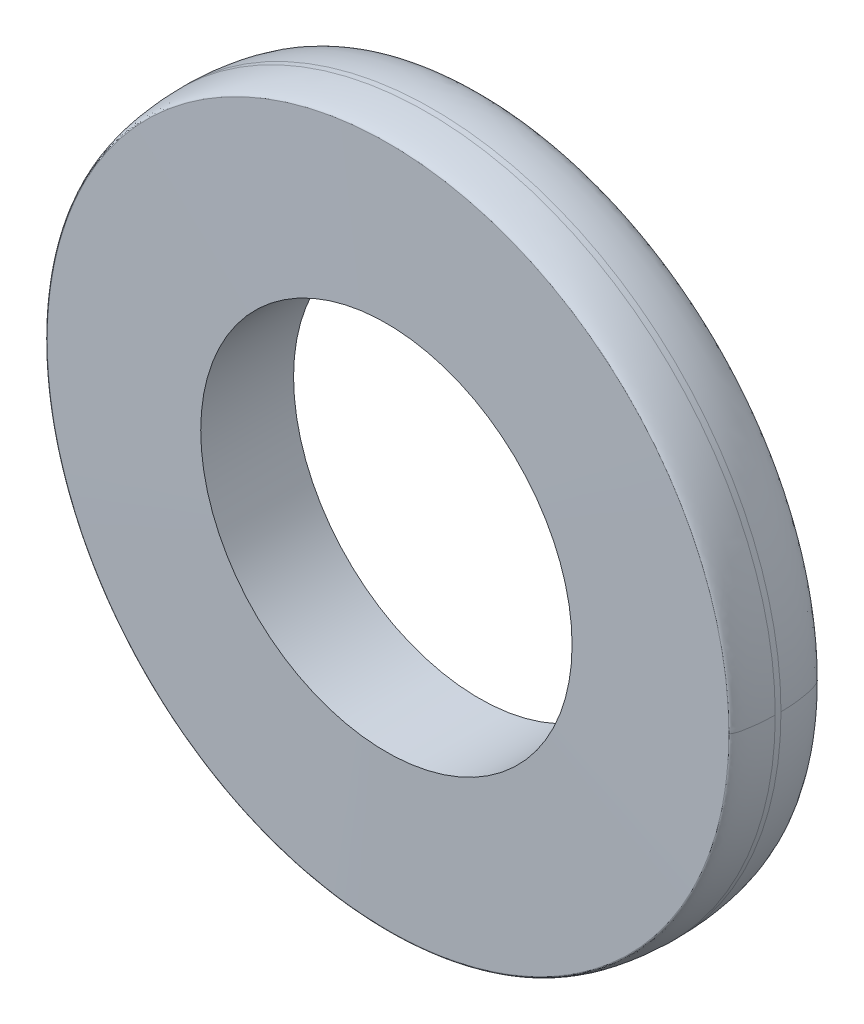
ISO-10303-21;
HEADER;
FILE_DESCRIPTION(('STEP AP214'),'2;1');
FILE_NAME('part.step','',(''),(''),'','','');
FILE_SCHEMA(('AUTOMOTIVE_DESIGN { 1 0 10303 214 1 1 1 1 }'));
ENDSEC;
DATA;
#1=APPLICATION_CONTEXT('core data for automotive mechanical design processes');
#2=APPLICATION_PROTOCOL_DEFINITION('international standard','automotive_design',2000,#1);
#3=PRODUCT_CONTEXT('',#1,'mechanical');
#4=PRODUCT('Part','Part','',(#3));
#5=PRODUCT_RELATED_PRODUCT_CATEGORY('part','',(#4));
#6=PRODUCT_DEFINITION_FORMATION('','',#4);
#7=PRODUCT_DEFINITION_CONTEXT('part definition',#1,'design');
#8=PRODUCT_DEFINITION('design','',#6,#7);
#9=PRODUCT_DEFINITION_SHAPE('','',#8);
#10=(LENGTH_UNIT() NAMED_UNIT(*) SI_UNIT(.MILLI.,.METRE.));
#11=(NAMED_UNIT(*) PLANE_ANGLE_UNIT() SI_UNIT($,.RADIAN.));
#12=(NAMED_UNIT(*) SI_UNIT($,.STERADIAN.) SOLID_ANGLE_UNIT());
#13=UNCERTAINTY_MEASURE_WITH_UNIT(LENGTH_MEASURE(1.E-05),#10,'distance_accuracy_value','');
#14=(GEOMETRIC_REPRESENTATION_CONTEXT(3) GLOBAL_UNCERTAINTY_ASSIGNED_CONTEXT((#13)) GLOBAL_UNIT_ASSIGNED_CONTEXT((#10,
#11,#12)) REPRESENTATION_CONTEXT('',''));
#15=CARTESIAN_POINT('',(0.,0.,0.));
#16=DIRECTION('',(0.,0.,1.));
#17=DIRECTION('',(1.,0.,0.));
#18=AXIS2_PLACEMENT_3D('',#15,#16,#17);
#19=CARTESIAN_POINT('',(30.,0.,0.));
#20=DIRECTION('',(0.,0.,-1.));
#21=DIRECTION('',(1.,0.,0.));
#22=AXIS2_PLACEMENT_3D('',#19,#20,#21);
#23=CYLINDRICAL_SURFACE('',#22,6.);
#24=CARTESIAN_POINT('',(30.,0.,-0.800000000000393));
#25=DIRECTION('',(0.,0.,1.));
#26=DIRECTION('',(1.,0.,0.));
#27=AXIS2_PLACEMENT_3D('',#24,#25,#26);
#28=CIRCLE('',#27,6.);
#29=CARTESIAN_POINT('',(24.,0.,-0.800000000000393));
#30=VERTEX_POINT('',#29);
#31=CARTESIAN_POINT('',(36.,0.,-0.800000000000393));
#32=VERTEX_POINT('',#31);
#33=EDGE_CURVE('E238',#30,#32,#28,.T.);
#34=ORIENTED_EDGE('',*,*,#33,.T.);
#35=CARTESIAN_POINT('',(30.,0.,-0.800000000000393));
#36=DIRECTION('',(0.,0.,1.));
#37=DIRECTION('',(-1.,0.,0.));
#38=AXIS2_PLACEMENT_3D('',#35,#36,#37);
#39=CIRCLE('',#38,6.);
#40=EDGE_CURVE('E235',#32,#30,#39,.T.);
#41=ORIENTED_EDGE('',*,*,#40,.T.);
#42=DIRECTION('',(0.,0.,1.));
#43=VECTOR('',#42,1.);
#44=CARTESIAN_POINT('',(24.,0.,0.));
#45=LINE('',#44,#43);
#46=CARTESIAN_POINT('',(24.,0.,-0.701366409497633));
#47=VERTEX_POINT('',#46);
#48=EDGE_CURVE('E10',#30,#47,#45,.T.);
#49=ORIENTED_EDGE('',*,*,#48,.T.);
#50=CARTESIAN_POINT('',(30.,0.,-0.701366409496622));
#51=DIRECTION('',(0.,0.,-1.));
#52=DIRECTION('',(-1.,0.,0.));
#53=AXIS2_PLACEMENT_3D('',#50,#51,#52);
#54=CIRCLE('',#53,6.);
#55=CARTESIAN_POINT('',(36.,0.,-0.701366409497633));
#56=VERTEX_POINT('',#55);
#57=EDGE_CURVE('E98',#47,#56,#54,.T.);
#58=ORIENTED_EDGE('',*,*,#57,.T.);
#59=CARTESIAN_POINT('',(30.,0.,-0.701366409497633));
#60=DIRECTION('',(0.,0.,1.));
#61=DIRECTION('',(1.,0.,0.));
#62=AXIS2_PLACEMENT_3D('',#59,#60,#61);
#63=CIRCLE('',#62,6.);
#64=EDGE_CURVE('E182',#47,#56,#63,.T.);
#65=ORIENTED_EDGE('',*,*,#64,.F.);
#66=ORIENTED_EDGE('',*,*,#48,.F.);
#67=EDGE_LOOP('',(#34,#41,#49,#58,#65,#66));
#68=FACE_BOUND('',#67,.T.);
#69=ADVANCED_FACE('F15',(#68),#23,.T.);
#70=CARTESIAN_POINT('',(30.,0.,0.));
#71=DIRECTION('',(0.,0.,-1.));
#72=DIRECTION('',(1.,0.,0.));
#73=AXIS2_PLACEMENT_3D('',#70,#71,#72);
#74=CYLINDRICAL_SURFACE('',#73,3.2);
#75=CARTESIAN_POINT('',(30.,0.,-1.6));
#76=DIRECTION('',(0.,0.,1.));
#77=DIRECTION('',(1.,0.,0.));
#78=AXIS2_PLACEMENT_3D('',#75,#76,#77);
#79=CIRCLE('',#78,3.2);
#80=CARTESIAN_POINT('',(26.8,0.,-1.6));
#81=VERTEX_POINT('',#80);
#82=EDGE_CURVE('E105',#81,#81,#79,.T.);
#83=ORIENTED_EDGE('',*,*,#82,.F.);
#84=DIRECTION('',(0.,0.,1.));
#85=VECTOR('',#84,1.);
#86=CARTESIAN_POINT('',(26.8,0.,0.));
#87=LINE('',#86,#85);
#88=CARTESIAN_POINT('',(26.8,0.,0.));
#89=VERTEX_POINT('',#88);
#90=EDGE_CURVE('E33',#81,#89,#87,.T.);
#91=ORIENTED_EDGE('',*,*,#90,.T.);
#92=CARTESIAN_POINT('',(30.,0.,0.));
#93=DIRECTION('',(0.,0.,1.));
#94=DIRECTION('',(1.,0.,0.));
#95=AXIS2_PLACEMENT_3D('',#92,#93,#94);
#96=CIRCLE('',#95,3.2);
#97=CARTESIAN_POINT('',(33.2,0.,0.));
#98=VERTEX_POINT('',#97);
#99=EDGE_CURVE('E78',#89,#98,#96,.T.);
#100=ORIENTED_EDGE('',*,*,#99,.T.);
#101=CARTESIAN_POINT('',(30.,0.,0.));
#102=DIRECTION('',(0.,0.,1.));
#103=DIRECTION('',(1.,0.,0.));
#104=AXIS2_PLACEMENT_3D('',#101,#102,#103);
#105=CIRCLE('',#104,3.2);
#106=EDGE_CURVE('E74',#98,#89,#105,.T.);
#107=ORIENTED_EDGE('',*,*,#106,.T.);
#108=ORIENTED_EDGE('',*,*,#90,.F.);
#109=EDGE_LOOP('',(#83,#91,#100,#107,#108));
#110=FACE_BOUND('',#109,.T.);
#111=ADVANCED_FACE('F85',(#110),#74,.F.);
#112=CARTESIAN_POINT('',(30.,3.,-1.6));
#113=DIRECTION('',(0.,0.,1.));
#114=DIRECTION('',(1.,0.,0.));
#115=AXIS2_PLACEMENT_3D('',#112,#113,#114);
#116=PLANE('',#115);
#117=ORIENTED_EDGE('',*,*,#82,.T.);
#118=EDGE_LOOP('',(#117));
#119=FACE_BOUND('',#118,.T.);
#120=CARTESIAN_POINT('',(30.,0.,-1.6));
#121=DIRECTION('',(0.,0.,1.));
#122=DIRECTION('',(-1.,0.,0.));
#123=AXIS2_PLACEMENT_3D('',#120,#121,#122);
#124=CIRCLE('',#123,5.8063392313732);
#125=CARTESIAN_POINT('',(35.8063392313732,0.,-1.6));
#126=VERTEX_POINT('',#125);
#127=CARTESIAN_POINT('',(24.1936607686268,0.,-1.6));
#128=VERTEX_POINT('',#127);
#129=EDGE_CURVE('E79',#126,#128,#124,.T.);
#130=ORIENTED_EDGE('',*,*,#129,.F.);
#131=CARTESIAN_POINT('',(30.,0.,-1.6));
#132=DIRECTION('',(0.,0.,1.));
#133=DIRECTION('',(1.,0.,0.));
#134=AXIS2_PLACEMENT_3D('',#131,#132,#133);
#135=CIRCLE('',#134,5.8063392313732);
#136=EDGE_CURVE('E184',#128,#126,#135,.T.);
#137=ORIENTED_EDGE('',*,*,#136,.F.);
#138=EDGE_LOOP('',(#130,#137));
#139=FACE_BOUND('',#138,.T.);
#140=ADVANCED_FACE('F140',(#119,#139),#116,.F.);
#141=CARTESIAN_POINT('',(24.1936607686268,0.,-1.6));
#142=CARTESIAN_POINT('',(24.1936607686268,-5.8063392313732,-1.6));
#143=CARTESIAN_POINT('',(30.,-5.8063392313732,-1.6));
#144=CARTESIAN_POINT('',(35.8063392313732,-5.8063392313732,-1.6));
#145=CARTESIAN_POINT('',(35.8063392313732,0.,-1.6));
#146=CARTESIAN_POINT('',(35.8063392313732,5.8063392313732,-1.6));
#147=CARTESIAN_POINT('',(30.,5.8063392313732,-1.6));
#148=CARTESIAN_POINT('',(24.1936607686268,5.8063392313732,-1.6));
#149=CARTESIAN_POINT('',(24.1936607686268,0.,-1.6));
#150=CARTESIAN_POINT('',(24.1823051950255,0.,-1.6));
#151=CARTESIAN_POINT('',(24.1823051950255,-5.81769480497445,-1.6));
#152=CARTESIAN_POINT('',(30.,-5.81769480497445,-1.6));
#153=CARTESIAN_POINT('',(35.8176948049745,-5.81769480497445,-1.6));
#154=CARTESIAN_POINT('',(35.8176948049745,0.,-1.6));
#155=CARTESIAN_POINT('',(35.8176948049745,5.81769480497445,-1.6));
#156=CARTESIAN_POINT('',(30.,5.81769480497445,-1.6));
#157=CARTESIAN_POINT('',(24.1823051950255,5.81769480497445,-1.6));
#158=CARTESIAN_POINT('',(24.1823051950255,0.,-1.6));
#159=CARTESIAN_POINT('',(24.1598204836808,0.,-1.5918225297912));
#160=CARTESIAN_POINT('',(24.1598204836808,-5.8401795163192,-1.5918225297912));
#161=CARTESIAN_POINT('',(30.,-5.8401795163192,-1.5918225297912));
#162=CARTESIAN_POINT('',(35.8401795163192,-5.8401795163192,-1.5918225297912));
#163=CARTESIAN_POINT('',(35.8401795163192,0.,-1.5918225297912));
#164=CARTESIAN_POINT('',(35.8401795163192,5.8401795163192,-1.5918225297912));
#165=CARTESIAN_POINT('',(30.,5.8401795163192,-1.5918225297912));
#166=CARTESIAN_POINT('',(24.1598204836808,5.8401795163192,-1.5918225297912));
#167=CARTESIAN_POINT('',(24.1598204836808,0.,-1.5918225297912));
#168=CARTESIAN_POINT('',(24.1267728464192,0.,-1.55502547306696));
#169=CARTESIAN_POINT('',(24.1267728464192,-5.87322715358078,-1.55502547306696));
#170=CARTESIAN_POINT('',(30.,-5.87322715358078,-1.55502547306696));
#171=CARTESIAN_POINT('',(35.8732271535808,-5.87322715358078,-1.55502547306696));
#172=CARTESIAN_POINT('',(35.8732271535808,0.,-1.55502547306696));
#173=CARTESIAN_POINT('',(35.8732271535808,5.87322715358078,-1.55502547306696));
#174=CARTESIAN_POINT('',(30.,5.87322715358078,-1.55502547306696));
#175=CARTESIAN_POINT('',(24.1267728464192,5.87322715358078,-1.55502547306696));
#176=CARTESIAN_POINT('',(24.1267728464192,0.,-1.55502547306696));
#177=CARTESIAN_POINT('',(24.0848655645913,0.,-1.45950479029294));
#178=CARTESIAN_POINT('',(24.0848655645913,-5.91513443540874,-1.45950479029294));
#179=CARTESIAN_POINT('',(30.,-5.91513443540874,-1.45950479029294));
#180=CARTESIAN_POINT('',(35.9151344354087,-5.91513443540874,-1.45950479029294));
#181=CARTESIAN_POINT('',(35.9151344354087,0.,-1.45950479029294));
#182=CARTESIAN_POINT('',(35.9151344354087,5.91513443540874,-1.45950479029294));
#183=CARTESIAN_POINT('',(30.,5.91513443540874,-1.45950479029294));
#184=CARTESIAN_POINT('',(24.0848655645913,5.91513443540874,-1.45950479029294));
#185=CARTESIAN_POINT('',(24.0848655645913,0.,-1.45950479029294));
#186=CARTESIAN_POINT('',(24.0404339071554,0.,-1.27744318091335));
#187=CARTESIAN_POINT('',(24.0404339071554,-5.95956609284458,-1.27744318091335));
#188=CARTESIAN_POINT('',(30.,-5.95956609284458,-1.27744318091335));
#189=CARTESIAN_POINT('',(35.9595660928446,-5.95956609284458,-1.27744318091335));
#190=CARTESIAN_POINT('',(35.9595660928446,0.,-1.27744318091335));
#191=CARTESIAN_POINT('',(35.9595660928446,5.95956609284458,-1.27744318091335));
#192=CARTESIAN_POINT('',(30.,5.95956609284458,-1.27744318091335));
#193=CARTESIAN_POINT('',(24.0404339071554,5.95956609284458,-1.27744318091335));
#194=CARTESIAN_POINT('',(24.0404339071554,0.,-1.27744318091335));
#195=CARTESIAN_POINT('',(24.0152230661895,0.,-1.09612786657397));
#196=CARTESIAN_POINT('',(24.0152230661895,-5.98477693381051,-1.09612786657397));
#197=CARTESIAN_POINT('',(30.,-5.98477693381051,-1.09612786657397));
#198=CARTESIAN_POINT('',(35.9847769338105,-5.98477693381051,-1.09612786657397));
#199=CARTESIAN_POINT('',(35.9847769338105,0.,-1.09612786657397));
#200=CARTESIAN_POINT('',(35.9847769338105,5.98477693381051,-1.09612786657397));
#201=CARTESIAN_POINT('',(30.,5.98477693381051,-1.09612786657397));
#202=CARTESIAN_POINT('',(24.0152230661895,5.98477693381051,-1.09612786657397));
#203=CARTESIAN_POINT('',(24.0152230661895,0.,-1.09612786657397));
#204=CARTESIAN_POINT('',(24.0042897505086,0.,-0.950202262335004));
#205=CARTESIAN_POINT('',(24.0042897505086,-5.99571024949142,-0.950202262335005));
#206=CARTESIAN_POINT('',(30.,-5.99571024949142,-0.950202262335004));
#207=CARTESIAN_POINT('',(35.9957102494914,-5.99571024949142,-0.950202262335005));
#208=CARTESIAN_POINT('',(35.9957102494914,0.,-0.950202262335004));
#209=CARTESIAN_POINT('',(35.9957102494914,5.99571024949142,-0.950202262335005));
#210=CARTESIAN_POINT('',(30.,5.99571024949142,-0.950202262335004));
#211=CARTESIAN_POINT('',(24.0042897505086,5.99571024949142,-0.950202262335005));
#212=CARTESIAN_POINT('',(24.0042897505086,0.,-0.950202262335004));
#213=CARTESIAN_POINT('',(24.0008098857186,0.,-0.851316488468443));
#214=CARTESIAN_POINT('',(24.0008098857186,-5.99919011428141,-0.851316488468443));
#215=CARTESIAN_POINT('',(30.,-5.99919011428141,-0.851316488468443));
#216=CARTESIAN_POINT('',(35.9991901142814,-5.99919011428141,-0.851316488468443));
#217=CARTESIAN_POINT('',(35.9991901142814,0.,-0.851316488468443));
#218=CARTESIAN_POINT('',(35.9991901142814,5.99919011428141,-0.851316488468443));
#219=CARTESIAN_POINT('',(30.,5.99919011428141,-0.851316488468443));
#220=CARTESIAN_POINT('',(24.0008098857186,5.99919011428141,-0.851316488468443));
#221=CARTESIAN_POINT('',(24.0008098857186,0.,-0.851316488468443));
#222=CARTESIAN_POINT('',(24.0000201274692,0.,-0.801316930978833));
#223=CARTESIAN_POINT('',(24.0000201274692,-5.99997987253079,-0.801316930978833));
#224=CARTESIAN_POINT('',(30.,-5.99997987253079,-0.801316930978833));
#225=CARTESIAN_POINT('',(35.9999798725308,-5.99997987253079,-0.801316930978833));
#226=CARTESIAN_POINT('',(35.9999798725308,0.,-0.801316930978833));
#227=CARTESIAN_POINT('',(35.9999798725308,5.99997987253079,-0.801316930978833));
#228=CARTESIAN_POINT('',(30.,5.99997987253079,-0.801316930978833));
#229=CARTESIAN_POINT('',(24.0000201274692,5.99997987253079,-0.801316930978833));
#230=CARTESIAN_POINT('',(24.0000201274692,0.,-0.801316930978833));
#231=CARTESIAN_POINT('',(24.,0.,-0.800000000000393));
#232=CARTESIAN_POINT('',(24.,-6.,-0.800000000000392));
#233=CARTESIAN_POINT('',(30.,-6.,-0.800000000000393));
#234=CARTESIAN_POINT('',(36.,-6.,-0.800000000000392));
#235=CARTESIAN_POINT('',(36.,0.,-0.800000000000393));
#236=CARTESIAN_POINT('',(36.,6.,-0.800000000000392));
#237=CARTESIAN_POINT('',(30.,6.,-0.800000000000393));
#238=CARTESIAN_POINT('',(24.,6.,-0.800000000000392));
#239=CARTESIAN_POINT('',(24.,0.,-0.800000000000393));
#240=(BOUNDED_SURFACE() B_SPLINE_SURFACE(5,2,((#141,#142,#143,#144,#145,#146,#147,#148,#149),
(#150,#151,#152,#153,#154,#155,#156,#157,#158),(#159,#160,#161,#162,#163,#164,#165,#166,#167),
(#168,#169,#170,#171,#172,#173,#174,#175,#176),(#177,#178,#179,#180,#181,#182,#183,#184,#185),
(#186,#187,#188,#189,#190,#191,#192,#193,#194),(#195,#196,#197,#198,#199,#200,#201,#202,#203),
(#204,#205,#206,#207,#208,#209,#210,#211,#212),(#213,#214,#215,#216,#217,#218,#219,#220,#221),
(#222,#223,#224,#225,#226,#227,#228,#229,#230),(#231,#232,#233,#234,#235,#236,#237,#238,#239)),
.UNSPECIFIED.,.F.,.T.,.F.) B_SPLINE_SURFACE_WITH_KNOTS((6,1,1,1,1,1,6),(3,2,2,2,3),(0.,0.1,0.2,
0.3,0.4,0.5,0.502705302004715),(0.,1.5707963267949,3.14159265358979,4.71238898038469,
6.28318530717959),.UNSPECIFIED.) GEOMETRIC_REPRESENTATION_ITEM() RATIONAL_B_SPLINE_SURFACE(((1.,
0.707106781186548,1.,0.707106781186548,1.,0.707106781186548,1.,0.707106781186548,1.),(1.,
0.707106781186548,1.,0.707106781186548,1.,0.707106781186548,1.,0.707106781186548,1.),(1.,
0.707106781186548,1.,0.707106781186548,1.,0.707106781186548,1.,0.707106781186548,1.),(1.,
0.707106781186548,1.,0.707106781186548,1.,0.707106781186548,1.,0.707106781186548,1.),(1.,
0.707106781186548,1.,0.707106781186548,1.,0.707106781186548,1.,0.707106781186548,1.),(1.,
0.707106781186548,1.,0.707106781186548,1.,0.707106781186548,1.,0.707106781186548,1.),(1.,
0.707106781186548,1.,0.707106781186548,1.,0.707106781186548,1.,0.707106781186548,1.),(1.,
0.707106781186548,1.,0.707106781186548,1.,0.707106781186548,1.,0.707106781186548,1.),(1.,
0.707106781186548,1.,0.707106781186548,1.,0.707106781186548,1.,0.707106781186548,1.),(1.,
0.707106781186548,1.,0.707106781186548,1.,0.707106781186548,1.,0.707106781186548,1.),(1.,
0.707106781186548,1.,0.707106781186548,1.,0.707106781186548,1.,0.707106781186548,1.))) REPRESENTATION_ITEM('') SURFACE());
#241=CARTESIAN_POINT('',(35.8063392313732,0.,-1.6));
#242=CARTESIAN_POINT('',(35.8099378753464,0.,-1.6));
#243=CARTESIAN_POINT('',(35.8134726247188,0.,-1.59950721564896));
#244=CARTESIAN_POINT('',(35.8206184009906,0.,-1.59756463817466));
#245=CARTESIAN_POINT('',(35.8241287090741,0.,-1.59608642434894));
#246=CARTESIAN_POINT('',(35.8352869308805,0.,-1.58998694561831));
#247=CARTESIAN_POINT('',(35.8422611236592,0.,-1.58375549246989));
#248=CARTESIAN_POINT('',(35.8641150043949,0.,-1.55964714317547));
#249=CARTESIAN_POINT('',(35.8775926398337,0.,-1.53446812127592));
#250=CARTESIAN_POINT('',(35.9142939112526,0.,-1.45153185081873));
#251=CARTESIAN_POINT('',(35.9377417361998,0.,-1.36662566906088));
#252=CARTESIAN_POINT('',(35.9802687650628,0.,-1.13751947712534));
#253=CARTESIAN_POINT('',(35.9972755095937,0.,-0.97826214411609));
#254=CARTESIAN_POINT('',(36.,0.,-0.800000000000393));
#255=(BOUNDED_CURVE() B_SPLINE_CURVE(3,(#241,#242,#243,#244,#245,#246,#247,#248,#249,#250,#251,
#252,#253,#254),.UNSPECIFIED.,.F.,.F.) B_SPLINE_CURVE_WITH_KNOTS((4,2,2,2,2,2,4),(0.,
0.00256248450711401,0.005273204596122,0.011618915438262,0.0284820292416233,0.0698556169275208,
0.123340505807867),
.UNSPECIFIED.) CURVE() GEOMETRIC_REPRESENTATION_ITEM() RATIONAL_B_SPLINE_CURVE((1.,1.,1.,1.,1.,
1.,1.,1.,1.,1.,1.,1.,1.,1.)) REPRESENTATION_ITEM(''));
#256=EDGE_CURVE('E232',#126,#32,#255,.T.);
#257=CARTESIAN_POINT('',(24.,0.,-0.800000000000393));
#258=CARTESIAN_POINT('',(24.0027244904063,0.,-0.97826214411609));
#259=CARTESIAN_POINT('',(24.0197312349372,0.,-1.13751947712534));
#260=CARTESIAN_POINT('',(24.0622582638002,0.,-1.36662566906088));
#261=CARTESIAN_POINT('',(24.0857060887474,0.,-1.45153185081873));
#262=CARTESIAN_POINT('',(24.1224073601663,0.,-1.53446812127592));
#263=CARTESIAN_POINT('',(24.1358849956051,0.,-1.55964714317547));
#264=CARTESIAN_POINT('',(24.1577388763408,0.,-1.58375549246989));
#265=CARTESIAN_POINT('',(24.1647130691195,0.,-1.58998694561831));
#266=CARTESIAN_POINT('',(24.1758712909259,0.,-1.59608642434894));
#267=CARTESIAN_POINT('',(24.1793815990094,0.,-1.59756463817466));
#268=CARTESIAN_POINT('',(24.1865273752812,0.,-1.59950721564896));
#269=CARTESIAN_POINT('',(24.1900621246536,0.,-1.6));
#270=CARTESIAN_POINT('',(24.1936607686268,0.,-1.6));
#271=(BOUNDED_CURVE() B_SPLINE_CURVE(3,(#257,#258,#259,#260,#261,#262,#263,#264,#265,#266,#267,
#268,#269,#270),.UNSPECIFIED.,.F.,.F.) B_SPLINE_CURVE_WITH_KNOTS((4,2,2,2,2,2,4),(0.,
0.0534848888803462,0.0948584765662437,0.111721590369605,0.118067301211745,0.120778021300753,
0.123340505807867),
.UNSPECIFIED.) CURVE() GEOMETRIC_REPRESENTATION_ITEM() RATIONAL_B_SPLINE_CURVE((1.,1.,1.,1.,1.,
1.,1.,1.,1.,1.,1.,1.,1.,1.)) REPRESENTATION_ITEM(''));
#272=EDGE_CURVE('E109',#30,#128,#271,.T.);
#273=CARTESIAN_POINT('',(30.,-5.8063392313732,-1.6));
#274=CARTESIAN_POINT('',(35.8063392313732,-5.8063392313732,-1.6));
#275=CARTESIAN_POINT('',(35.8063392313732,0.,-1.6));
#276=CARTESIAN_POINT('',(35.8063392313732,5.8063392313732,-1.6));
#277=CARTESIAN_POINT('',(30.,5.8063392313732,-1.6));
#278=CARTESIAN_POINT('',(24.1936607686268,5.8063392313732,-1.6));
#279=CARTESIAN_POINT('',(24.1936607686268,0.,-1.6));
#280=CARTESIAN_POINT('',(24.1936607686268,-5.8063392313732,-1.6));
#281=CARTESIAN_POINT('',(30.,-5.8063392313732,-1.6));
#282=CARTESIAN_POINT('',(30.,-5.81769480497445,-1.6));
#283=CARTESIAN_POINT('',(35.8176948049745,-5.81769480497445,-1.6));
#284=CARTESIAN_POINT('',(35.8176948049745,0.,-1.6));
#285=CARTESIAN_POINT('',(35.8176948049745,5.81769480497445,-1.6));
#286=CARTESIAN_POINT('',(30.,5.81769480497445,-1.6));
#287=CARTESIAN_POINT('',(24.1823051950255,5.81769480497445,-1.6));
#288=CARTESIAN_POINT('',(24.1823051950255,0.,-1.6));
#289=CARTESIAN_POINT('',(24.1823051950255,-5.81769480497445,-1.6));
#290=CARTESIAN_POINT('',(30.,-5.81769480497445,-1.6));
#291=CARTESIAN_POINT('',(30.,-5.8401795163192,-1.5918225297912));
#292=CARTESIAN_POINT('',(35.8401795163192,-5.8401795163192,-1.5918225297912));
#293=CARTESIAN_POINT('',(35.8401795163192,0.,-1.5918225297912));
#294=CARTESIAN_POINT('',(35.8401795163192,5.8401795163192,-1.5918225297912));
#295=CARTESIAN_POINT('',(30.,5.8401795163192,-1.5918225297912));
#296=CARTESIAN_POINT('',(24.1598204836808,5.8401795163192,-1.5918225297912));
#297=CARTESIAN_POINT('',(24.1598204836808,0.,-1.5918225297912));
#298=CARTESIAN_POINT('',(24.1598204836808,-5.8401795163192,-1.5918225297912));
#299=CARTESIAN_POINT('',(30.,-5.8401795163192,-1.5918225297912));
#300=CARTESIAN_POINT('',(30.,-5.87322715358078,-1.55502547306696));
#301=CARTESIAN_POINT('',(35.8732271535808,-5.87322715358078,-1.55502547306696));
#302=CARTESIAN_POINT('',(35.8732271535808,0.,-1.55502547306696));
#303=CARTESIAN_POINT('',(35.8732271535808,5.87322715358078,-1.55502547306696));
#304=CARTESIAN_POINT('',(30.,5.87322715358078,-1.55502547306696));
#305=CARTESIAN_POINT('',(24.1267728464192,5.87322715358078,-1.55502547306696));
#306=CARTESIAN_POINT('',(24.1267728464192,0.,-1.55502547306696));
#307=CARTESIAN_POINT('',(24.1267728464192,-5.87322715358078,-1.55502547306696));
#308=CARTESIAN_POINT('',(30.,-5.87322715358078,-1.55502547306696));
#309=CARTESIAN_POINT('',(30.,-5.91513443540874,-1.45950479029294));
#310=CARTESIAN_POINT('',(35.9151344354087,-5.91513443540874,-1.45950479029294));
#311=CARTESIAN_POINT('',(35.9151344354087,0.,-1.45950479029294));
#312=CARTESIAN_POINT('',(35.9151344354087,5.91513443540874,-1.45950479029294));
#313=CARTESIAN_POINT('',(30.,5.91513443540874,-1.45950479029294));
#314=CARTESIAN_POINT('',(24.0848655645913,5.91513443540874,-1.45950479029294));
#315=CARTESIAN_POINT('',(24.0848655645913,0.,-1.45950479029294));
#316=CARTESIAN_POINT('',(24.0848655645913,-5.91513443540874,-1.45950479029294));
#317=CARTESIAN_POINT('',(30.,-5.91513443540874,-1.45950479029294));
#318=CARTESIAN_POINT('',(30.,-5.95956609284458,-1.27744318091335));
#319=CARTESIAN_POINT('',(35.9595660928446,-5.95956609284458,-1.27744318091335));
#320=CARTESIAN_POINT('',(35.9595660928446,0.,-1.27744318091335));
#321=CARTESIAN_POINT('',(35.9595660928446,5.95956609284458,-1.27744318091335));
#322=CARTESIAN_POINT('',(30.,5.95956609284458,-1.27744318091335));
#323=CARTESIAN_POINT('',(24.0404339071554,5.95956609284458,-1.27744318091335));
#324=CARTESIAN_POINT('',(24.0404339071554,0.,-1.27744318091335));
#325=CARTESIAN_POINT('',(24.0404339071554,-5.95956609284458,-1.27744318091335));
#326=CARTESIAN_POINT('',(30.,-5.95956609284458,-1.27744318091335));
#327=CARTESIAN_POINT('',(30.,-5.98477693381051,-1.09612786657397));
#328=CARTESIAN_POINT('',(35.9847769338105,-5.98477693381051,-1.09612786657397));
#329=CARTESIAN_POINT('',(35.9847769338105,0.,-1.09612786657397));
#330=CARTESIAN_POINT('',(35.9847769338105,5.98477693381051,-1.09612786657397));
#331=CARTESIAN_POINT('',(30.,5.98477693381051,-1.09612786657397));
#332=CARTESIAN_POINT('',(24.0152230661895,5.98477693381051,-1.09612786657397));
#333=CARTESIAN_POINT('',(24.0152230661895,0.,-1.09612786657397));
#334=CARTESIAN_POINT('',(24.0152230661895,-5.98477693381051,-1.09612786657397));
#335=CARTESIAN_POINT('',(30.,-5.98477693381051,-1.09612786657397));
#336=CARTESIAN_POINT('',(30.,-5.99571024949142,-0.950202262335004));
#337=CARTESIAN_POINT('',(35.9957102494914,-5.99571024949142,-0.950202262335005));
#338=CARTESIAN_POINT('',(35.9957102494914,0.,-0.950202262335004));
#339=CARTESIAN_POINT('',(35.9957102494914,5.99571024949142,-0.950202262335005));
#340=CARTESIAN_POINT('',(30.,5.99571024949142,-0.950202262335004));
#341=CARTESIAN_POINT('',(24.0042897505086,5.99571024949142,-0.950202262335005));
#342=CARTESIAN_POINT('',(24.0042897505086,0.,-0.950202262335004));
#343=CARTESIAN_POINT('',(24.0042897505086,-5.99571024949142,-0.950202262335005));
#344=CARTESIAN_POINT('',(30.,-5.99571024949142,-0.950202262335004));
#345=CARTESIAN_POINT('',(30.,-5.99919011428141,-0.851316488468443));
#346=CARTESIAN_POINT('',(35.9991901142814,-5.99919011428141,-0.851316488468443));
#347=CARTESIAN_POINT('',(35.9991901142814,0.,-0.851316488468443));
#348=CARTESIAN_POINT('',(35.9991901142814,5.99919011428141,-0.851316488468443));
#349=CARTESIAN_POINT('',(30.,5.99919011428141,-0.851316488468443));
#350=CARTESIAN_POINT('',(24.0008098857186,5.99919011428141,-0.851316488468443));
#351=CARTESIAN_POINT('',(24.0008098857186,0.,-0.851316488468443));
#352=CARTESIAN_POINT('',(24.0008098857186,-5.99919011428141,-0.851316488468443));
#353=CARTESIAN_POINT('',(30.,-5.99919011428141,-0.851316488468443));
#354=CARTESIAN_POINT('',(30.,-5.99997987253079,-0.801316930978833));
#355=CARTESIAN_POINT('',(35.9999798725308,-5.99997987253079,-0.801316930978833));
#356=CARTESIAN_POINT('',(35.9999798725308,0.,-0.801316930978833));
#357=CARTESIAN_POINT('',(35.9999798725308,5.99997987253079,-0.801316930978833));
#358=CARTESIAN_POINT('',(30.,5.99997987253079,-0.801316930978833));
#359=CARTESIAN_POINT('',(24.0000201274692,5.99997987253079,-0.801316930978833));
#360=CARTESIAN_POINT('',(24.0000201274692,0.,-0.801316930978833));
#361=CARTESIAN_POINT('',(24.0000201274692,-5.99997987253079,-0.801316930978833));
#362=CARTESIAN_POINT('',(30.,-5.99997987253079,-0.801316930978833));
#363=CARTESIAN_POINT('',(30.,-6.,-0.800000000000393));
#364=CARTESIAN_POINT('',(36.,-6.,-0.800000000000392));
#365=CARTESIAN_POINT('',(36.,0.,-0.800000000000393));
#366=CARTESIAN_POINT('',(36.,6.,-0.800000000000392));
#367=CARTESIAN_POINT('',(30.,6.,-0.800000000000393));
#368=CARTESIAN_POINT('',(24.,6.,-0.800000000000392));
#369=CARTESIAN_POINT('',(24.,0.,-0.800000000000393));
#370=CARTESIAN_POINT('',(24.,-6.,-0.800000000000392));
#371=CARTESIAN_POINT('',(30.,-6.,-0.800000000000393));
#372=(BOUNDED_SURFACE() B_SPLINE_SURFACE(5,2,((#273,#274,#275,#276,#277,#278,#279,#280,#281),
(#282,#283,#284,#285,#286,#287,#288,#289,#290),(#291,#292,#293,#294,#295,#296,#297,#298,#299),
(#300,#301,#302,#303,#304,#305,#306,#307,#308),(#309,#310,#311,#312,#313,#314,#315,#316,#317),
(#318,#319,#320,#321,#322,#323,#324,#325,#326),(#327,#328,#329,#330,#331,#332,#333,#334,#335),
(#336,#337,#338,#339,#340,#341,#342,#343,#344),(#345,#346,#347,#348,#349,#350,#351,#352,#353),
(#354,#355,#356,#357,#358,#359,#360,#361,#362),(#363,#364,#365,#366,#367,#368,#369,#370,#371)),
.UNSPECIFIED.,.F.,.T.,.F.) B_SPLINE_SURFACE_WITH_KNOTS((6,1,1,1,1,1,6),(3,2,2,2,3),(0.,0.1,0.2,
0.3,0.4,0.5,0.502705302004715),(1.5707963267949,3.14159265358979,4.71238898038469,
6.28318530717959,7.85398163397449),
.UNSPECIFIED.) GEOMETRIC_REPRESENTATION_ITEM() RATIONAL_B_SPLINE_SURFACE(((1.,0.707106781186548,
1.,0.707106781186548,1.,0.707106781186548,1.,0.707106781186548,1.),(1.,0.707106781186548,1.,
0.707106781186548,1.,0.707106781186548,1.,0.707106781186548,1.),(1.,0.707106781186548,1.,
0.707106781186548,1.,0.707106781186548,1.,0.707106781186548,1.),(1.,0.707106781186548,1.,
0.707106781186548,1.,0.707106781186548,1.,0.707106781186548,1.),(1.,0.707106781186548,1.,
0.707106781186548,1.,0.707106781186548,1.,0.707106781186548,1.),(1.,0.707106781186548,1.,
0.707106781186548,1.,0.707106781186548,1.,0.707106781186548,1.),(1.,0.707106781186548,1.,
0.707106781186548,1.,0.707106781186548,1.,0.707106781186548,1.),(1.,0.707106781186548,1.,
0.707106781186548,1.,0.707106781186548,1.,0.707106781186548,1.),(1.,0.707106781186548,1.,
0.707106781186548,1.,0.707106781186548,1.,0.707106781186548,1.),(1.,0.707106781186548,1.,
0.707106781186548,1.,0.707106781186548,1.,0.707106781186548,1.),(1.,0.707106781186548,1.,
0.707106781186548,1.,0.707106781186548,1.,0.707106781186548,1.))) REPRESENTATION_ITEM('') SURFACE());
#373=ORIENTED_EDGE('',*,*,#256,.F.);
#374=ORIENTED_EDGE('',*,*,#129,.T.);
#375=ORIENTED_EDGE('',*,*,#272,.F.);
#376=ORIENTED_EDGE('',*,*,#40,.F.);
#377=EDGE_LOOP('',(#373,#374,#375,#376));
#378=FACE_BOUND('',#377,.T.);
#379=ADVANCED_FACE('F130',(#378),#372,.F.);
#380=CARTESIAN_POINT('',(30.,0.,-0.0140760685299386));
#381=DIRECTION('',(0.,0.,-1.));
#382=DIRECTION('',(-1.,0.,0.));
#383=AXIS2_PLACEMENT_3D('',#380,#381,#382);
#384=CONICAL_SURFACE('',#383,4.53741083275418,1.56027185034286);
#385=CARTESIAN_POINT('',(30.,0.,-0.0281521370598771));
#386=DIRECTION('',(0.,0.,1.));
#387=DIRECTION('',(1.,0.,0.));
#388=AXIS2_PLACEMENT_3D('',#385,#386,#387);
#389=CIRCLE('',#388,5.87482166550835);
#390=CARTESIAN_POINT('',(35.8748216655084,0.,-0.0281521370598771));
#391=VERTEX_POINT('',#390);
#392=CARTESIAN_POINT('',(24.1251783344916,0.,-0.0281521370598771));
#393=VERTEX_POINT('',#392);
#394=EDGE_CURVE('E89',#391,#393,#389,.T.);
#395=ORIENTED_EDGE('',*,*,#394,.T.);
#396=CARTESIAN_POINT('',(30.,0.,-0.0281521370598771));
#397=DIRECTION('',(0.,0.,1.));
#398=DIRECTION('',(1.,0.,0.));
#399=AXIS2_PLACEMENT_3D('',#396,#397,#398);
#400=CIRCLE('',#399,5.87482166550835);
#401=EDGE_CURVE('E90',#393,#391,#400,.T.);
#402=ORIENTED_EDGE('',*,*,#401,.T.);
#403=DIRECTION('',(-0.999944618208903,0.,0.0105242821632199));
#404=VECTOR('',#403,1.);
#405=CARTESIAN_POINT('',(34.5374108327542,0.,-0.0140760685299386));
#406=LINE('',#405,#404);
#407=EDGE_CURVE('E80',#391,#98,#406,.T.);
#408=ORIENTED_EDGE('',*,*,#407,.T.);
#409=ORIENTED_EDGE('',*,*,#99,.F.);
#410=ORIENTED_EDGE('',*,*,#106,.F.);
#411=ORIENTED_EDGE('',*,*,#407,.F.);
#412=EDGE_LOOP('',(#395,#402,#408,#409,#410,#411));
#413=FACE_BOUND('',#412,.T.);
#414=ADVANCED_FACE('F75',(#413),#384,.T.);
#415=CARTESIAN_POINT('',(36.,0.,-0.701366409496622));
#416=CARTESIAN_POINT('',(36.,5.99999999999998,-0.701366409496622));
#417=CARTESIAN_POINT('',(30.,6.,-0.701366409496622));
#418=CARTESIAN_POINT('',(24.,5.99999999999998,-0.701366409496622));
#419=CARTESIAN_POINT('',(24.,0.,-0.701366409496622));
#420=CARTESIAN_POINT('',(35.9995842195152,0.,-0.67412342459429));
#421=CARTESIAN_POINT('',(35.9995842195152,5.99958421951516,-0.67412342459429));
#422=CARTESIAN_POINT('',(30.,5.99958421951516,-0.67412342459429));
#423=CARTESIAN_POINT('',(24.0004157804848,5.99958421951516,-0.67412342459429));
#424=CARTESIAN_POINT('',(24.0004157804848,0.,-0.67412342459429));
#425=CARTESIAN_POINT('',(35.9976466753253,0.,-0.599238318710859));
#426=CARTESIAN_POINT('',(35.9976466753253,5.9976466753253,-0.599238318710859));
#427=CARTESIAN_POINT('',(30.,5.9976466753253,-0.599238318710859));
#428=CARTESIAN_POINT('',(24.0023533246747,5.9976466753253,-0.599238318710859));
#429=CARTESIAN_POINT('',(24.0023533246747,0.,-0.599238318710859));
#430=CARTESIAN_POINT('',(35.9909993972564,0.,-0.479604552992104));
#431=CARTESIAN_POINT('',(35.9909993972564,5.9909993972564,-0.479604552992104));
#432=CARTESIAN_POINT('',(30.,5.9909993972564,-0.479604552992104));
#433=CARTESIAN_POINT('',(24.0090006027436,5.9909993972564,-0.479604552992104));
#434=CARTESIAN_POINT('',(24.0090006027436,0.,-0.479604552992104));
#435=CARTESIAN_POINT('',(35.9747232000661,0.,-0.325498796781791));
#436=CARTESIAN_POINT('',(35.9747232000661,5.97472320006605,-0.325498796781791));
#437=CARTESIAN_POINT('',(30.,5.97472320006605,-0.325498796781791));
#438=CARTESIAN_POINT('',(24.0252767999339,5.97472320006605,-0.325498796781791));
#439=CARTESIAN_POINT('',(24.0252767999339,0.,-0.325498796781791));
#440=CARTESIAN_POINT('',(35.9453385277902,0.,-0.163974792571029));
#441=CARTESIAN_POINT('',(35.9453385277902,5.94533852779016,-0.163974792571029));
#442=CARTESIAN_POINT('',(30.,5.94533852779016,-0.163974792571029));
#443=CARTESIAN_POINT('',(24.0546614722098,5.94533852779016,-0.163974792571029));
#444=CARTESIAN_POINT('',(24.0546614722098,0.,-0.163974792571029));
#445=CARTESIAN_POINT('',(35.9163121423734,0.,-0.0717596973073452));
#446=CARTESIAN_POINT('',(35.9163121423734,5.91631214237337,-0.0717596973073452));
#447=CARTESIAN_POINT('',(30.,5.91631214237337,-0.0717596973073452));
#448=CARTESIAN_POINT('',(24.0836878576266,5.91631214237337,-0.0717596973073452));
#449=CARTESIAN_POINT('',(24.0836878576266,0.,-0.0717596973073452));
#450=CARTESIAN_POINT('',(35.8950777733468,0.,-0.03621484293876));
#451=CARTESIAN_POINT('',(35.8950777733468,5.89507777334681,-0.03621484293876));
#452=CARTESIAN_POINT('',(30.,5.89507777334681,-0.03621484293876));
#453=CARTESIAN_POINT('',(24.1049222266532,5.89507777334681,-0.03621484293876));
#454=CARTESIAN_POINT('',(24.1049222266532,0.,-0.03621484293876));
#455=CARTESIAN_POINT('',(35.8814805046447,0.,-0.0282222204431707));
#456=CARTESIAN_POINT('',(35.8814805046447,5.88148050464468,-0.0282222204431707));
#457=CARTESIAN_POINT('',(30.,5.88148050464468,-0.0282222204431707));
#458=CARTESIAN_POINT('',(24.1185194953553,5.88148050464468,-0.0282222204431707));
#459=CARTESIAN_POINT('',(24.1185194953553,0.,-0.0282222204431707));
#460=CARTESIAN_POINT('',(35.8748216655084,0.,-0.0281521370598771));
#461=CARTESIAN_POINT('',(35.8748216655084,5.87482166550835,-0.0281521370598771));
#462=CARTESIAN_POINT('',(30.,5.87482166550835,-0.0281521370598771));
#463=CARTESIAN_POINT('',(24.1251783344916,5.87482166550835,-0.0281521370598771));
#464=CARTESIAN_POINT('',(24.1251783344916,0.,-0.0281521370598771));
#465=(BOUNDED_SURFACE() B_SPLINE_SURFACE(5,2,((#415,#416,#417,#418,#419),(#420,#421,#422,#423,
#424),(#425,#426,#427,#428,#429),(#430,#431,#432,#433,#434),(#435,#436,#437,#438,#439),(#440,
#441,#442,#443,#444),(#445,#446,#447,#448,#449),(#450,#451,#452,#453,#454),(#455,#456,#457,#458,
#459),(#460,#461,#462,#463,#464)),.UNSPECIFIED.,.F.,.F.,.F.) B_SPLINE_SURFACE_WITH_KNOTS((6,1,1,
1,1,6),(3,2,3),(0.543404821793418,0.6,0.7,0.8,0.9,1.),(3.14159265358979,4.71238898038469,
6.28318530717959),.UNSPECIFIED.) GEOMETRIC_REPRESENTATION_ITEM() RATIONAL_B_SPLINE_SURFACE(((1.,
0.707106781186548,1.,0.707106781186548,1.),(1.,0.707106781186548,1.,0.707106781186548,1.),(1.,
0.707106781186548,1.,0.707106781186548,1.),(1.,0.707106781186548,1.,0.707106781186548,1.),(1.,
0.707106781186548,1.,0.707106781186548,1.),(1.,0.707106781186548,1.,0.707106781186548,1.),(1.,
0.707106781186548,1.,0.707106781186548,1.),(1.,0.707106781186548,1.,0.707106781186548,1.),(1.,
0.707106781186548,1.,0.707106781186548,1.),(1.,0.707106781186548,1.,0.707106781186548,1.))) REPRESENTATION_ITEM('') SURFACE());
#466=CARTESIAN_POINT('',(36.,0.,-0.701366409496622));
#467=CARTESIAN_POINT('',(35.9993011648306,0.,-0.655576968518117));
#468=CARTESIAN_POINT('',(35.9976329766355,0.,-0.610395263690353));
#469=CARTESIAN_POINT('',(35.9951051728217,0.,-0.566488986324666));
#470=CARTESIAN_POINT('',(35.9925247450962,0.,-0.521668666481417));
#471=CARTESIAN_POINT('',(35.9890498702881,0.,-0.478178239649487));
#472=CARTESIAN_POINT('',(35.9848477210161,0.,-0.436697316533103));
#473=CARTESIAN_POINT('',(35.9807045761229,0.,-0.395798846810074));
#474=CARTESIAN_POINT('',(35.9758559060958,0.,-0.356854562979047));
#475=CARTESIAN_POINT('',(35.9704892758792,0.,-0.320474826791202));
#476=CARTESIAN_POINT('',(35.9654415639659,0.,-0.286256999150845));
#477=CARTESIAN_POINT('',(35.9599367044365,0.,-0.254308457140262));
#478=CARTESIAN_POINT('',(35.9541368044936,0.,-0.225092909707142));
#479=CARTESIAN_POINT('',(35.9486844511268,0.,-0.197628041351436));
#480=CARTESIAN_POINT('',(35.9429720208518,0.,-0.172578722711697));
#481=CARTESIAN_POINT('',(35.9371278796137,0.,-0.150284569331307));
#482=CARTESIAN_POINT('',(35.9317985155425,0.,-0.129954181138389));
#483=CARTESIAN_POINT('',(35.9263599227589,0.,-0.111915041996811));
#484=CARTESIAN_POINT('',(35.92089780009,0.,-0.0963835854611977));
#485=CARTESIAN_POINT('',(35.9156553396653,0.,-0.0814767349267132));
#486=CARTESIAN_POINT('',(35.9103914654614,0.,-0.0688802096442022));
#487=CARTESIAN_POINT('',(35.9051667145948,0.,-0.0587426259447771));
#488=CARTESIAN_POINT('',(35.899982980328,0.,-0.0486846267506924));
#489=CARTESIAN_POINT('',(35.8948380872431,0.,-0.0410477606260251));
#490=CARTESIAN_POINT('',(35.8897714329848,0.,-0.0359273302596429));
#491=CARTESIAN_POINT('',(35.8850967166103,0.,-0.0312029977005909));
#492=CARTESIAN_POINT('',(35.8804886099673,0.,-0.0286207646972725));
#493=CARTESIAN_POINT('',(35.8759592832619,0.,-0.0282098000167102));
#494=CARTESIAN_POINT('',(35.8755795351484,0.,-0.0281753438883945));
#495=CARTESIAN_POINT('',(35.8752003290435,0.,-0.0281561224424839));
#496=CARTESIAN_POINT('',(35.8748216655084,0.,-0.0281521370598771));
#497=(BOUNDED_CURVE() B_SPLINE_CURVE(3,(#466,#467,#468,#469,#470,#471,#472,#473,#474,#475,#476,
#477,#478,#479,#480,#481,#482,#483,#484,#485,#486,#487,#488,#489,#490,#491,#492,#493,#494,#495,
#496),.UNSPECIFIED.,.F.,.F.) B_SPLINE_CURVE_WITH_KNOTS((4,3,3,3,3,3,3,3,3,3,4),(0.,
0.0131679041743672,0.0266099382563006,0.0398632263370266,0.0523289222088349,0.0640476379667794,
0.0747341186963437,0.0849908367710454,0.0951670350829916,0.104556039829181,0.105343233394938),
.UNSPECIFIED.) CURVE() GEOMETRIC_REPRESENTATION_ITEM() RATIONAL_B_SPLINE_CURVE((1.,1.,1.,1.,1.,
1.,1.,1.,1.,1.,1.,1.,1.,1.,1.,1.,1.,1.,1.,1.,1.,1.,1.,1.,1.,1.,1.,1.,1.,1.,1.)) REPRESENTATION_ITEM(''));
#498=EDGE_CURVE('E179',#56,#391,#497,.T.);
#499=CARTESIAN_POINT('',(24.1251783344916,0.,-0.0281521370598771));
#500=CARTESIAN_POINT('',(24.1232670194698,0.,-0.0281722533925485));
#501=CARTESIAN_POINT('',(24.1214182777162,0.,-0.0285797953131424));
#502=CARTESIAN_POINT('',(24.117206422472,0.,-0.0302411333689307));
#503=CARTESIAN_POINT('',(24.1149613466348,0.,-0.031730212158963));
#504=CARTESIAN_POINT('',(24.1089928308472,0.,-0.0367227325947252));
#505=CARTESIAN_POINT('',(24.105468211961,0.,-0.041195475959744));
#506=CARTESIAN_POINT('',(24.094458761746,0.,-0.0575098625245801));
#507=CARTESIAN_POINT('',(24.087322567571,0.,-0.0740480180462353));
#508=CARTESIAN_POINT('',(24.0696971909052,0.,-0.121516101542471));
#509=CARTESIAN_POINT('',(24.0579499357523,0.,-0.16557214969928));
#510=CARTESIAN_POINT('',(24.0231740644583,0.,-0.33657423392638));
#511=CARTESIAN_POINT('',(24.0029718394737,0.,-0.506643999786962));
#512=CARTESIAN_POINT('',(24.,0.,-0.701366409496622));
#513=(BOUNDED_CURVE() B_SPLINE_CURVE(3,(#499,#500,#501,#502,#503,#504,#505,#506,#507,#508,#509,
#510,#511,#512),.UNSPECIFIED.,.F.,.F.) B_SPLINE_CURVE_WITH_KNOTS((4,2,2,2,2,2,4),(0.,
0.000573426263930507,0.00135845534147624,0.00291006743575733,0.00728739663981669,
0.0166857342745604,0.0380415433799861),
.UNSPECIFIED.) CURVE() GEOMETRIC_REPRESENTATION_ITEM() RATIONAL_B_SPLINE_CURVE((1.,1.,1.,1.,1.,
1.,1.,1.,1.,1.,1.,1.,1.,1.)) REPRESENTATION_ITEM(''));
#514=EDGE_CURVE('E192',#393,#47,#513,.T.);
#515=ORIENTED_EDGE('',*,*,#498,.F.);
#516=ORIENTED_EDGE('',*,*,#57,.F.);
#517=ORIENTED_EDGE('',*,*,#514,.F.);
#518=ORIENTED_EDGE('',*,*,#394,.F.);
#519=EDGE_LOOP('',(#515,#516,#517,#518));
#520=FACE_BOUND('',#519,.T.);
#521=ADVANCED_FACE('F152',(#520),#465,.F.);
#522=CARTESIAN_POINT('',(24.1251783344916,0.,-0.0281521370598771));
#523=CARTESIAN_POINT('',(24.1251783344916,-5.87482166550835,-0.0281521370598771));
#524=CARTESIAN_POINT('',(30.,-5.87482166550835,-0.0281521370598771));
#525=CARTESIAN_POINT('',(35.8748216655084,-5.87482166550835,-0.0281521370598771));
#526=CARTESIAN_POINT('',(35.8748216655084,0.,-0.0281521370598771));
#527=CARTESIAN_POINT('',(24.1232670194698,0.,-0.0281722533925485));
#528=CARTESIAN_POINT('',(24.1232670194698,-5.87673298053021,-0.0281722533925485));
#529=CARTESIAN_POINT('',(30.,-5.87673298053021,-0.0281722533925485));
#530=CARTESIAN_POINT('',(35.8767329805302,-5.87673298053021,-0.0281722533925485));
#531=CARTESIAN_POINT('',(35.8767329805302,0.,-0.0281722533925485));
#532=CARTESIAN_POINT('',(24.1214182777162,0.,-0.0285797953131424));
#533=CARTESIAN_POINT('',(24.1214182777162,-5.87858172228376,-0.0285797953131424));
#534=CARTESIAN_POINT('',(30.,-5.87858172228376,-0.0285797953131424));
#535=CARTESIAN_POINT('',(35.8785817222838,-5.87858172228376,-0.0285797953131424));
#536=CARTESIAN_POINT('',(35.8785817222838,0.,-0.0285797953131424));
#537=CARTESIAN_POINT('',(24.117206422472,0.,-0.0302411333689307));
#538=CARTESIAN_POINT('',(24.117206422472,-5.88279357752798,-0.0302411333689307));
#539=CARTESIAN_POINT('',(30.,-5.88279357752798,-0.0302411333689307));
#540=CARTESIAN_POINT('',(35.882793577528,-5.88279357752798,-0.0302411333689307));
#541=CARTESIAN_POINT('',(35.882793577528,0.,-0.0302411333689307));
#542=CARTESIAN_POINT('',(24.1149613466348,0.,-0.031730212158963));
#543=CARTESIAN_POINT('',(24.1149613466348,-5.88503865336517,-0.031730212158963));
#544=CARTESIAN_POINT('',(30.,-5.88503865336517,-0.031730212158963));
#545=CARTESIAN_POINT('',(35.8850386533652,-5.88503865336517,-0.031730212158963));
#546=CARTESIAN_POINT('',(35.8850386533652,0.,-0.031730212158963));
#547=CARTESIAN_POINT('',(24.1089928308472,0.,-0.0367227325947252));
#548=CARTESIAN_POINT('',(24.1089928308472,-5.8910071691528,-0.0367227325947252));
#549=CARTESIAN_POINT('',(30.,-5.8910071691528,-0.0367227325947252));
#550=CARTESIAN_POINT('',(35.8910071691528,-5.8910071691528,-0.0367227325947252));
#551=CARTESIAN_POINT('',(35.8910071691528,0.,-0.0367227325947252));
#552=CARTESIAN_POINT('',(24.105468211961,0.,-0.041195475959744));
#553=CARTESIAN_POINT('',(24.105468211961,-5.89453178803899,-0.041195475959744));
#554=CARTESIAN_POINT('',(30.,-5.89453178803899,-0.041195475959744));
#555=CARTESIAN_POINT('',(35.894531788039,-5.89453178803899,-0.041195475959744));
#556=CARTESIAN_POINT('',(35.894531788039,0.,-0.041195475959744));
#557=CARTESIAN_POINT('',(24.094458761746,0.,-0.0575098625245801));
#558=CARTESIAN_POINT('',(24.094458761746,-5.90554123825397,-0.0575098625245802));
#559=CARTESIAN_POINT('',(30.,-5.90554123825397,-0.0575098625245801));
#560=CARTESIAN_POINT('',(35.905541238254,-5.90554123825397,-0.0575098625245802));
#561=CARTESIAN_POINT('',(35.905541238254,0.,-0.0575098625245801));
#562=CARTESIAN_POINT('',(24.087322567571,0.,-0.0740480180462353));
#563=CARTESIAN_POINT('',(24.087322567571,-5.91267743242896,-0.0740480180462354));
#564=CARTESIAN_POINT('',(30.,-5.91267743242896,-0.0740480180462353));
#565=CARTESIAN_POINT('',(35.912677432429,-5.91267743242896,-0.0740480180462354));
#566=CARTESIAN_POINT('',(35.912677432429,0.,-0.0740480180462353));
#567=CARTESIAN_POINT('',(24.0696971909052,0.,-0.121516101542471));
#568=CARTESIAN_POINT('',(24.0696971909052,-5.93030280909483,-0.121516101542471));
#569=CARTESIAN_POINT('',(30.,-5.93030280909483,-0.121516101542471));
#570=CARTESIAN_POINT('',(35.9303028090948,-5.93030280909483,-0.121516101542471));
#571=CARTESIAN_POINT('',(35.9303028090948,0.,-0.121516101542471));
#572=CARTESIAN_POINT('',(24.0579499357523,0.,-0.16557214969928));
#573=CARTESIAN_POINT('',(24.0579499357523,-5.94205006424767,-0.16557214969928));
#574=CARTESIAN_POINT('',(30.,-5.94205006424767,-0.16557214969928));
#575=CARTESIAN_POINT('',(35.9420500642477,-5.94205006424767,-0.16557214969928));
#576=CARTESIAN_POINT('',(35.9420500642477,0.,-0.16557214969928));
#577=CARTESIAN_POINT('',(24.0231740644583,0.,-0.33657423392638));
#578=CARTESIAN_POINT('',(24.0231740644583,-5.9768259355417,-0.33657423392638));
#579=CARTESIAN_POINT('',(30.,-5.9768259355417,-0.33657423392638));
#580=CARTESIAN_POINT('',(35.9768259355417,-5.9768259355417,-0.33657423392638));
#581=CARTESIAN_POINT('',(35.9768259355417,0.,-0.33657423392638));
#582=CARTESIAN_POINT('',(24.0029718394737,0.,-0.506643999786962));
#583=CARTESIAN_POINT('',(24.0029718394737,-5.99702816052627,-0.506643999786962));
#584=CARTESIAN_POINT('',(30.,-5.99702816052627,-0.506643999786962));
#585=CARTESIAN_POINT('',(35.9970281605263,-5.99702816052627,-0.506643999786962));
#586=CARTESIAN_POINT('',(35.9970281605263,0.,-0.506643999786962));
#587=CARTESIAN_POINT('',(24.,0.,-0.701366409496622));
#588=CARTESIAN_POINT('',(24.,-5.99999999999998,-0.701366409496622));
#589=CARTESIAN_POINT('',(30.,-6.,-0.701366409496622));
#590=CARTESIAN_POINT('',(36.,-5.99999999999998,-0.701366409496622));
#591=CARTESIAN_POINT('',(36.,0.,-0.701366409496622));
#592=(BOUNDED_SURFACE() B_SPLINE_SURFACE(3,2,((#522,#523,#524,#525,#526),(#527,#528,#529,#530,
#531),(#532,#533,#534,#535,#536),(#537,#538,#539,#540,#541),(#542,#543,#544,#545,#546),(#547,
#548,#549,#550,#551),(#552,#553,#554,#555,#556),(#557,#558,#559,#560,#561),(#562,#563,#564,#565,
#566),(#567,#568,#569,#570,#571),(#572,#573,#574,#575,#576),(#577,#578,#579,#580,#581),(#582,
#583,#584,#585,#586),(#587,#588,#589,#590,#591)),.UNSPECIFIED.,.F.,.F.,
.F.) B_SPLINE_SURFACE_WITH_KNOTS((4,2,2,2,2,2,4),(3,2,3),(0.,0.000573426263930507,
0.00135845534147624,0.00291006743575733,0.00728739663981669,0.0166857342745604,
0.0380415433799861),(0.,1.5707963267949,3.14159265358979),
.UNSPECIFIED.) GEOMETRIC_REPRESENTATION_ITEM() RATIONAL_B_SPLINE_SURFACE(((1.,0.707106781186548,
1.,0.707106781186548,1.),(1.,0.707106781186548,1.,0.707106781186548,1.),(1.,0.707106781186548,
1.,0.707106781186548,1.),(1.,0.707106781186548,1.,0.707106781186548,1.),(1.,0.707106781186548,
1.,0.707106781186548,1.),(1.,0.707106781186548,1.,0.707106781186548,1.),(1.,0.707106781186548,
1.,0.707106781186548,1.),(1.,0.707106781186548,1.,0.707106781186548,1.),(1.,0.707106781186548,
1.,0.707106781186548,1.),(1.,0.707106781186548,1.,0.707106781186548,1.),(1.,0.707106781186548,
1.,0.707106781186548,1.),(1.,0.707106781186548,1.,0.707106781186548,1.),(1.,0.707106781186548,
1.,0.707106781186548,1.),(1.,0.707106781186548,1.,0.707106781186548,1.))) REPRESENTATION_ITEM('') SURFACE());
#593=ORIENTED_EDGE('',*,*,#498,.T.);
#594=ORIENTED_EDGE('',*,*,#401,.F.);
#595=ORIENTED_EDGE('',*,*,#514,.T.);
#596=ORIENTED_EDGE('',*,*,#64,.T.);
#597=EDGE_LOOP('',(#593,#594,#595,#596));
#598=FACE_BOUND('',#597,.T.);
#599=ADVANCED_FACE('F159',(#598),#592,.T.);
#600=CARTESIAN_POINT('',(24.,0.,-0.800000000000393));
#601=CARTESIAN_POINT('',(24.,-6.,-0.800000000000392));
#602=CARTESIAN_POINT('',(30.,-6.,-0.800000000000393));
#603=CARTESIAN_POINT('',(36.,-6.,-0.800000000000392));
#604=CARTESIAN_POINT('',(36.,0.,-0.800000000000393));
#605=CARTESIAN_POINT('',(24.0027244904063,0.,-0.97826214411609));
#606=CARTESIAN_POINT('',(24.0027244904063,-5.9972755095937,-0.978262144116089));
#607=CARTESIAN_POINT('',(30.,-5.9972755095937,-0.97826214411609));
#608=CARTESIAN_POINT('',(35.9972755095937,-5.9972755095937,-0.978262144116089));
#609=CARTESIAN_POINT('',(35.9972755095937,0.,-0.97826214411609));
#610=CARTESIAN_POINT('',(24.0197312349372,0.,-1.13751947712534));
#611=CARTESIAN_POINT('',(24.0197312349372,-5.98026876506277,-1.13751947712534));
#612=CARTESIAN_POINT('',(30.,-5.98026876506277,-1.13751947712534));
#613=CARTESIAN_POINT('',(35.9802687650628,-5.98026876506277,-1.13751947712534));
#614=CARTESIAN_POINT('',(35.9802687650628,0.,-1.13751947712534));
#615=CARTESIAN_POINT('',(24.0622582638002,0.,-1.36662566906088));
#616=CARTESIAN_POINT('',(24.0622582638002,-5.93774173619984,-1.36662566906088));
#617=CARTESIAN_POINT('',(30.,-5.93774173619984,-1.36662566906088));
#618=CARTESIAN_POINT('',(35.9377417361998,-5.93774173619984,-1.36662566906088));
#619=CARTESIAN_POINT('',(35.9377417361998,0.,-1.36662566906088));
#620=CARTESIAN_POINT('',(24.0857060887474,0.,-1.45153185081873));
#621=CARTESIAN_POINT('',(24.0857060887474,-5.9142939112526,-1.45153185081873));
#622=CARTESIAN_POINT('',(30.,-5.9142939112526,-1.45153185081873));
#623=CARTESIAN_POINT('',(35.9142939112526,-5.9142939112526,-1.45153185081873));
#624=CARTESIAN_POINT('',(35.9142939112526,0.,-1.45153185081873));
#625=CARTESIAN_POINT('',(24.1224073601663,0.,-1.53446812127592));
#626=CARTESIAN_POINT('',(24.1224073601663,-5.87759263983369,-1.53446812127592));
#627=CARTESIAN_POINT('',(30.,-5.8775926398337,-1.53446812127592));
#628=CARTESIAN_POINT('',(35.8775926398337,-5.87759263983369,-1.53446812127592));
#629=CARTESIAN_POINT('',(35.8775926398337,0.,-1.53446812127592));
#630=CARTESIAN_POINT('',(24.1358849956051,0.,-1.55964714317547));
#631=CARTESIAN_POINT('',(24.1358849956051,-5.86411500439486,-1.55964714317547));
#632=CARTESIAN_POINT('',(30.,-5.86411500439486,-1.55964714317547));
#633=CARTESIAN_POINT('',(35.8641150043949,-5.86411500439486,-1.55964714317547));
#634=CARTESIAN_POINT('',(35.8641150043949,0.,-1.55964714317547));
#635=CARTESIAN_POINT('',(24.1577388763408,0.,-1.58375549246989));
#636=CARTESIAN_POINT('',(24.1577388763408,-5.8422611236592,-1.58375549246989));
#637=CARTESIAN_POINT('',(30.,-5.8422611236592,-1.58375549246989));
#638=CARTESIAN_POINT('',(35.8422611236592,-5.8422611236592,-1.58375549246989));
#639=CARTESIAN_POINT('',(35.8422611236592,0.,-1.58375549246989));
#640=CARTESIAN_POINT('',(24.1647130691195,0.,-1.58998694561831));
#641=CARTESIAN_POINT('',(24.1647130691195,-5.83528693088054,-1.58998694561831));
#642=CARTESIAN_POINT('',(30.,-5.83528693088054,-1.58998694561831));
#643=CARTESIAN_POINT('',(35.8352869308805,-5.83528693088054,-1.58998694561831));
#644=CARTESIAN_POINT('',(35.8352869308805,0.,-1.58998694561831));
#645=CARTESIAN_POINT('',(24.1758712909259,0.,-1.59608642434894));
#646=CARTESIAN_POINT('',(24.1758712909259,-5.82412870907407,-1.59608642434894));
#647=CARTESIAN_POINT('',(30.,-5.82412870907407,-1.59608642434894));
#648=CARTESIAN_POINT('',(35.8241287090741,-5.82412870907407,-1.59608642434894));
#649=CARTESIAN_POINT('',(35.8241287090741,0.,-1.59608642434894));
#650=CARTESIAN_POINT('',(24.1793815990094,0.,-1.59756463817466));
#651=CARTESIAN_POINT('',(24.1793815990094,-5.82061840099058,-1.59756463817466));
#652=CARTESIAN_POINT('',(30.,-5.82061840099058,-1.59756463817466));
#653=CARTESIAN_POINT('',(35.8206184009906,-5.82061840099058,-1.59756463817466));
#654=CARTESIAN_POINT('',(35.8206184009906,0.,-1.59756463817466));
#655=CARTESIAN_POINT('',(24.1865273752812,0.,-1.59950721564896));
#656=CARTESIAN_POINT('',(24.1865273752812,-5.81347262471881,-1.59950721564896));
#657=CARTESIAN_POINT('',(30.,-5.81347262471881,-1.59950721564896));
#658=CARTESIAN_POINT('',(35.8134726247188,-5.81347262471881,-1.59950721564896));
#659=CARTESIAN_POINT('',(35.8134726247188,0.,-1.59950721564896));
#660=CARTESIAN_POINT('',(24.1900621246536,0.,-1.6));
#661=CARTESIAN_POINT('',(24.1900621246536,-5.80993787534643,-1.6));
#662=CARTESIAN_POINT('',(30.,-5.80993787534643,-1.6));
#663=CARTESIAN_POINT('',(35.8099378753464,-5.80993787534643,-1.6));
#664=CARTESIAN_POINT('',(35.8099378753464,0.,-1.6));
#665=CARTESIAN_POINT('',(24.1936607686268,0.,-1.6));
#666=CARTESIAN_POINT('',(24.1936607686268,-5.8063392313732,-1.6));
#667=CARTESIAN_POINT('',(30.,-5.8063392313732,-1.6));
#668=CARTESIAN_POINT('',(35.8063392313732,-5.8063392313732,-1.6));
#669=CARTESIAN_POINT('',(35.8063392313732,0.,-1.6));
#670=(BOUNDED_SURFACE() B_SPLINE_SURFACE(3,2,((#600,#601,#602,#603,#604),(#605,#606,#607,#608,
#609),(#610,#611,#612,#613,#614),(#615,#616,#617,#618,#619),(#620,#621,#622,#623,#624),(#625,
#626,#627,#628,#629),(#630,#631,#632,#633,#634),(#635,#636,#637,#638,#639),(#640,#641,#642,#643,
#644),(#645,#646,#647,#648,#649),(#650,#651,#652,#653,#654),(#655,#656,#657,#658,#659),(#660,
#661,#662,#663,#664),(#665,#666,#667,#668,#669)),.UNSPECIFIED.,.F.,.F.,
.F.) B_SPLINE_SURFACE_WITH_KNOTS((4,2,2,2,2,2,4),(3,2,3),(0.,0.0534848888803462,
0.0948584765662437,0.111721590369605,0.118067301211745,0.120778021300753,0.123340505807867),(0.,
1.5707963267949,3.14159265358979),
.UNSPECIFIED.) GEOMETRIC_REPRESENTATION_ITEM() RATIONAL_B_SPLINE_SURFACE(((1.,0.707106781186548,
1.,0.707106781186548,1.),(1.,0.707106781186548,1.,0.707106781186548,1.),(1.,0.707106781186548,
1.,0.707106781186548,1.),(1.,0.707106781186548,1.,0.707106781186548,1.),(1.,0.707106781186548,
1.,0.707106781186548,1.),(1.,0.707106781186548,1.,0.707106781186548,1.),(1.,0.707106781186548,
1.,0.707106781186548,1.),(1.,0.707106781186548,1.,0.707106781186548,1.),(1.,0.707106781186548,
1.,0.707106781186548,1.),(1.,0.707106781186548,1.,0.707106781186548,1.),(1.,0.707106781186548,
1.,0.707106781186548,1.),(1.,0.707106781186548,1.,0.707106781186548,1.),(1.,0.707106781186548,
1.,0.707106781186548,1.),(1.,0.707106781186548,1.,0.707106781186548,1.))) REPRESENTATION_ITEM('') SURFACE());
#671=ORIENTED_EDGE('',*,*,#256,.T.);
#672=ORIENTED_EDGE('',*,*,#33,.F.);
#673=ORIENTED_EDGE('',*,*,#272,.T.);
#674=ORIENTED_EDGE('',*,*,#136,.T.);
#675=EDGE_LOOP('',(#671,#672,#673,#674));
#676=FACE_BOUND('',#675,.T.);
#677=ADVANCED_FACE('F17',(#676),#670,.T.);
#678=CLOSED_SHELL('',(#69,#111,#140,#379,#414,#521,#599,#677));
#679=MANIFOLD_SOLID_BREP('B1',#678);
#680=ADVANCED_BREP_SHAPE_REPRESENTATION('',(#18,#679),#14);
#681=SHAPE_DEFINITION_REPRESENTATION(#9,#680);
ENDSEC;
END-ISO-10303-21;
